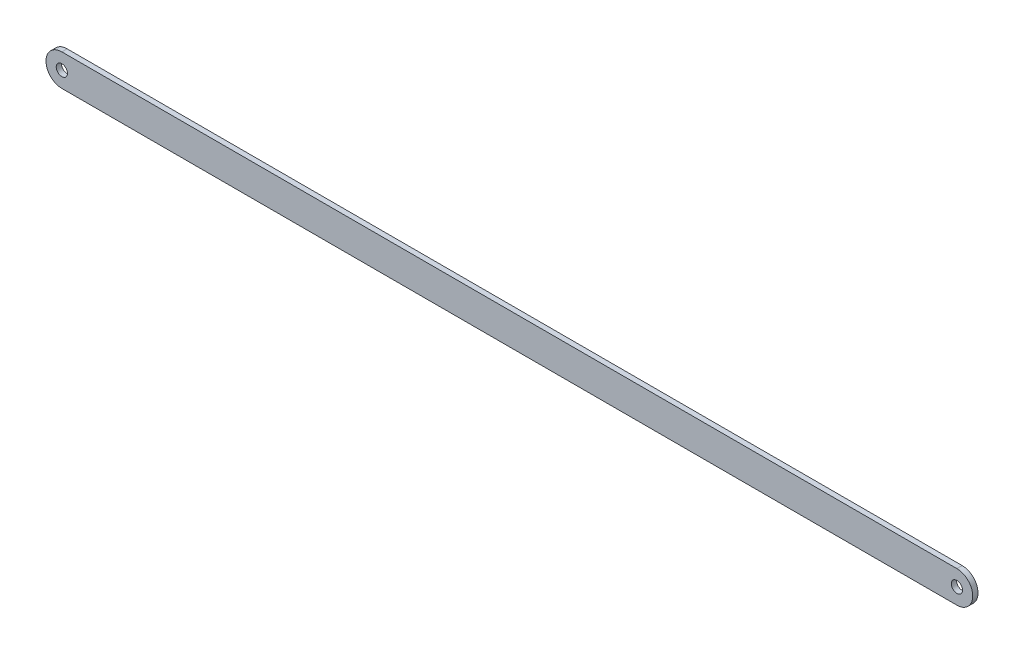
ISO-10303-21;
HEADER;
FILE_DESCRIPTION(('STEP AP214'),'2;1');
FILE_NAME('part.step','',(''),(''),'','','');
FILE_SCHEMA(('AUTOMOTIVE_DESIGN { 1 0 10303 214 1 1 1 1 }'));
ENDSEC;
DATA;
#1=APPLICATION_CONTEXT('core data for automotive mechanical design processes');
#2=APPLICATION_PROTOCOL_DEFINITION('international standard','automotive_design',2000,#1);
#3=PRODUCT_CONTEXT('',#1,'mechanical');
#4=PRODUCT('Part','Part','',(#3));
#5=PRODUCT_RELATED_PRODUCT_CATEGORY('part','',(#4));
#6=PRODUCT_DEFINITION_FORMATION('','',#4);
#7=PRODUCT_DEFINITION_CONTEXT('part definition',#1,'design');
#8=PRODUCT_DEFINITION('design','',#6,#7);
#9=PRODUCT_DEFINITION_SHAPE('','',#8);
#10=(LENGTH_UNIT() NAMED_UNIT(*) SI_UNIT(.MILLI.,.METRE.));
#11=(NAMED_UNIT(*) PLANE_ANGLE_UNIT() SI_UNIT($,.RADIAN.));
#12=(NAMED_UNIT(*) SI_UNIT($,.STERADIAN.) SOLID_ANGLE_UNIT());
#13=UNCERTAINTY_MEASURE_WITH_UNIT(LENGTH_MEASURE(1.E-05),#10,'distance_accuracy_value','');
#14=(GEOMETRIC_REPRESENTATION_CONTEXT(3) GLOBAL_UNCERTAINTY_ASSIGNED_CONTEXT((#13)) GLOBAL_UNIT_ASSIGNED_CONTEXT((#10,
#11,#12)) REPRESENTATION_CONTEXT('',''));
#15=CARTESIAN_POINT('',(0.,0.,0.));
#16=DIRECTION('',(0.,0.,1.));
#17=DIRECTION('',(1.,0.,0.));
#18=AXIS2_PLACEMENT_3D('',#15,#16,#17);
#19=CARTESIAN_POINT('',(269.108175275297,-1.31838984174237E-13,1.5875));
#20=DIRECTION('',(0.,0.,-1.));
#21=DIRECTION('',(-1.,0.,0.));
#22=AXIS2_PLACEMENT_3D('',#19,#20,#21);
#23=CYLINDRICAL_SURFACE('',#22,9.52499999999997);
#24=CARTESIAN_POINT('',(269.108175275297,-1.31838984174237E-13,-1.5875));
#25=DIRECTION('',(0.,0.,1.));
#26=DIRECTION('',(1.,0.,0.));
#27=AXIS2_PLACEMENT_3D('',#24,#25,#26);
#28=CIRCLE('',#27,9.52499999999997);
#29=CARTESIAN_POINT('',(269.108175275297,-9.52499999999997,-1.5875));
#30=VERTEX_POINT('',#29);
#31=CARTESIAN_POINT('',(269.108175275297,9.52499999999996,-1.5875));
#32=VERTEX_POINT('',#31);
#33=EDGE_CURVE('E97',#30,#32,#28,.T.);
#34=ORIENTED_EDGE('',*,*,#33,.T.);
#35=DIRECTION('',(0.,0.,-1.));
#36=VECTOR('',#35,1.);
#37=CARTESIAN_POINT('',(269.108175275297,9.52499999999996,1.5875));
#38=LINE('',#37,#36);
#39=CARTESIAN_POINT('',(269.108175275297,9.52499999999996,1.5875));
#40=VERTEX_POINT('',#39);
#41=EDGE_CURVE('E11',#40,#32,#38,.T.);
#42=ORIENTED_EDGE('',*,*,#41,.F.);
#43=CARTESIAN_POINT('',(269.108175275297,-1.31838984174237E-13,1.5875));
#44=DIRECTION('',(0.,0.,1.));
#45=DIRECTION('',(1.,0.,0.));
#46=AXIS2_PLACEMENT_3D('',#43,#44,#45);
#47=CIRCLE('',#46,9.52499999999997);
#48=CARTESIAN_POINT('',(269.108175275297,-9.52499999999997,1.5875));
#49=VERTEX_POINT('',#48);
#50=EDGE_CURVE('E85',#49,#40,#47,.T.);
#51=ORIENTED_EDGE('',*,*,#50,.F.);
#52=DIRECTION('',(0.,0.,-1.));
#53=VECTOR('',#52,1.);
#54=CARTESIAN_POINT('',(269.108175275297,-9.52499999999997,1.5875));
#55=LINE('',#54,#53);
#56=EDGE_CURVE('E93',#49,#30,#55,.T.);
#57=ORIENTED_EDGE('',*,*,#56,.T.);
#58=EDGE_LOOP('',(#34,#42,#51,#57));
#59=FACE_BOUND('',#58,.T.);
#60=ADVANCED_FACE('F34',(#59),#23,.T.);
#61=CARTESIAN_POINT('',(269.108175275297,9.52499999999996,1.5875));
#62=DIRECTION('',(0.,-1.,0.));
#63=DIRECTION('',(1.,0.,0.));
#64=AXIS2_PLACEMENT_3D('',#61,#62,#63);
#65=PLANE('',#64);
#66=DIRECTION('',(-1.,0.,0.));
#67=VECTOR('',#66,1.);
#68=CARTESIAN_POINT('',(269.108175275297,9.52499999999996,-1.5875));
#69=LINE('',#68,#67);
#70=CARTESIAN_POINT('',(-269.108175275297,9.52499999999992,-1.5875));
#71=VERTEX_POINT('',#70);
#72=EDGE_CURVE('E89',#32,#71,#69,.T.);
#73=ORIENTED_EDGE('',*,*,#72,.T.);
#74=DIRECTION('',(0.,0.,-1.));
#75=VECTOR('',#74,1.);
#76=CARTESIAN_POINT('',(-269.108175275297,9.52499999999992,1.5875));
#77=LINE('',#76,#75);
#78=CARTESIAN_POINT('',(-269.108175275297,9.52499999999992,1.5875));
#79=VERTEX_POINT('',#78);
#80=EDGE_CURVE('E42',#79,#71,#77,.T.);
#81=ORIENTED_EDGE('',*,*,#80,.F.);
#82=DIRECTION('',(-1.,0.,0.));
#83=VECTOR('',#82,1.);
#84=CARTESIAN_POINT('',(269.108175275297,9.52499999999996,1.5875));
#85=LINE('',#84,#83);
#86=EDGE_CURVE('E80',#40,#79,#85,.T.);
#87=ORIENTED_EDGE('',*,*,#86,.F.);
#88=ORIENTED_EDGE('',*,*,#41,.T.);
#89=EDGE_LOOP('',(#73,#81,#87,#88));
#90=FACE_BOUND('',#89,.T.);
#91=ADVANCED_FACE('F88',(#90),#65,.F.);
#92=CARTESIAN_POINT('',(-269.108175275297,0.,1.5875));
#93=DIRECTION('',(0.,0.,-1.));
#94=DIRECTION('',(-1.,0.,0.));
#95=AXIS2_PLACEMENT_3D('',#92,#93,#94);
#96=CYLINDRICAL_SURFACE('',#95,9.52499999999997);
#97=CARTESIAN_POINT('',(-269.108175275297,0.,-1.5875));
#98=DIRECTION('',(0.,0.,1.));
#99=DIRECTION('',(1.,0.,0.));
#100=AXIS2_PLACEMENT_3D('',#97,#98,#99);
#101=CIRCLE('',#100,9.52499999999997);
#102=CARTESIAN_POINT('',(-269.108175275297,-9.52500000000003,-1.5875));
#103=VERTEX_POINT('',#102);
#104=EDGE_CURVE('E67',#71,#103,#101,.T.);
#105=ORIENTED_EDGE('',*,*,#104,.T.);
#106=DIRECTION('',(0.,0.,-1.));
#107=VECTOR('',#106,1.);
#108=CARTESIAN_POINT('',(-269.108175275297,-9.52500000000003,1.5875));
#109=LINE('',#108,#107);
#110=CARTESIAN_POINT('',(-269.108175275297,-9.52500000000003,1.5875));
#111=VERTEX_POINT('',#110);
#112=EDGE_CURVE('E90',#111,#103,#109,.T.);
#113=ORIENTED_EDGE('',*,*,#112,.F.);
#114=CARTESIAN_POINT('',(-269.108175275297,0.,1.5875));
#115=DIRECTION('',(0.,0.,1.));
#116=DIRECTION('',(1.,0.,0.));
#117=AXIS2_PLACEMENT_3D('',#114,#115,#116);
#118=CIRCLE('',#117,9.52499999999997);
#119=EDGE_CURVE('E83',#79,#111,#118,.T.);
#120=ORIENTED_EDGE('',*,*,#119,.F.);
#121=ORIENTED_EDGE('',*,*,#80,.T.);
#122=EDGE_LOOP('',(#105,#113,#120,#121));
#123=FACE_BOUND('',#122,.T.);
#124=ADVANCED_FACE('F91',(#123),#96,.T.);
#125=CARTESIAN_POINT('',(269.108175275297,-9.52499999999997,1.5875));
#126=DIRECTION('',(0.,1.,0.));
#127=DIRECTION('',(-1.,0.,0.));
#128=AXIS2_PLACEMENT_3D('',#125,#126,#127);
#129=PLANE('',#128);
#130=DIRECTION('',(1.,0.,0.));
#131=VECTOR('',#130,1.);
#132=CARTESIAN_POINT('',(269.108175275297,-9.52499999999997,-1.5875));
#133=LINE('',#132,#131);
#134=EDGE_CURVE('E73',#103,#30,#133,.T.);
#135=ORIENTED_EDGE('',*,*,#134,.T.);
#136=ORIENTED_EDGE('',*,*,#56,.F.);
#137=DIRECTION('',(1.,0.,0.));
#138=VECTOR('',#137,1.);
#139=CARTESIAN_POINT('',(269.108175275297,-9.52499999999997,1.5875));
#140=LINE('',#139,#138);
#141=EDGE_CURVE('E50',#111,#49,#140,.T.);
#142=ORIENTED_EDGE('',*,*,#141,.F.);
#143=ORIENTED_EDGE('',*,*,#112,.T.);
#144=EDGE_LOOP('',(#135,#136,#142,#143));
#145=FACE_BOUND('',#144,.T.);
#146=ADVANCED_FACE('F105',(#145),#129,.F.);
#147=CARTESIAN_POINT('',(269.108175275297,-1.31838984174237E-13,1.5875));
#148=DIRECTION('',(0.,0.,1.));
#149=DIRECTION('',(1.,0.,0.));
#150=AXIS2_PLACEMENT_3D('',#147,#148,#149);
#151=PLANE('',#150);
#152=CARTESIAN_POINT('',(-269.108175275297,0.,1.5875));
#153=DIRECTION('',(0.,0.,1.));
#154=DIRECTION('',(1.,0.,0.));
#155=AXIS2_PLACEMENT_3D('',#152,#153,#154);
#156=CIRCLE('',#155,3.3782);
#157=CARTESIAN_POINT('',(-265.729975275297,0.,1.5875));
#158=VERTEX_POINT('',#157);
#159=EDGE_CURVE('E119',#158,#158,#156,.T.);
#160=ORIENTED_EDGE('',*,*,#159,.F.);
#161=EDGE_LOOP('',(#160));
#162=FACE_BOUND('',#161,.T.);
#163=CARTESIAN_POINT('',(269.108175275297,-1.31838984174237E-13,1.5875));
#164=DIRECTION('',(0.,0.,1.));
#165=DIRECTION('',(1.,0.,0.));
#166=AXIS2_PLACEMENT_3D('',#163,#164,#165);
#167=CIRCLE('',#166,3.3782);
#168=CARTESIAN_POINT('',(272.486375275297,-1.31838984174237E-13,1.5875));
#169=VERTEX_POINT('',#168);
#170=EDGE_CURVE('E113',#169,#169,#167,.T.);
#171=ORIENTED_EDGE('',*,*,#170,.F.);
#172=EDGE_LOOP('',(#171));
#173=FACE_BOUND('',#172,.T.);
#174=ORIENTED_EDGE('',*,*,#50,.T.);
#175=ORIENTED_EDGE('',*,*,#86,.T.);
#176=ORIENTED_EDGE('',*,*,#119,.T.);
#177=ORIENTED_EDGE('',*,*,#141,.T.);
#178=EDGE_LOOP('',(#174,#175,#176,#177));
#179=FACE_BOUND('',#178,.T.);
#180=ADVANCED_FACE('F81',(#162,#173,#179),#151,.T.);
#181=CARTESIAN_POINT('',(269.108175275297,-1.31838984174237E-13,-1.5875));
#182=DIRECTION('',(0.,0.,1.));
#183=DIRECTION('',(1.,0.,0.));
#184=AXIS2_PLACEMENT_3D('',#181,#182,#183);
#185=PLANE('',#184);
#186=CARTESIAN_POINT('',(-269.108175275297,0.,-1.5875));
#187=DIRECTION('',(0.,0.,1.));
#188=DIRECTION('',(1.,0.,0.));
#189=AXIS2_PLACEMENT_3D('',#186,#187,#188);
#190=CIRCLE('',#189,3.3782);
#191=CARTESIAN_POINT('',(-265.729975275297,0.,-1.5875));
#192=VERTEX_POINT('',#191);
#193=EDGE_CURVE('E116',#192,#192,#190,.T.);
#194=ORIENTED_EDGE('',*,*,#193,.T.);
#195=EDGE_LOOP('',(#194));
#196=FACE_BOUND('',#195,.T.);
#197=CARTESIAN_POINT('',(269.108175275297,-1.31838984174237E-13,-1.5875));
#198=DIRECTION('',(0.,0.,1.));
#199=DIRECTION('',(1.,0.,0.));
#200=AXIS2_PLACEMENT_3D('',#197,#198,#199);
#201=CIRCLE('',#200,3.3782);
#202=CARTESIAN_POINT('',(272.486375275297,-1.31838984174237E-13,-1.5875));
#203=VERTEX_POINT('',#202);
#204=EDGE_CURVE('E100',#203,#203,#201,.T.);
#205=ORIENTED_EDGE('',*,*,#204,.T.);
#206=EDGE_LOOP('',(#205));
#207=FACE_BOUND('',#206,.T.);
#208=ORIENTED_EDGE('',*,*,#33,.F.);
#209=ORIENTED_EDGE('',*,*,#134,.F.);
#210=ORIENTED_EDGE('',*,*,#104,.F.);
#211=ORIENTED_EDGE('',*,*,#72,.F.);
#212=EDGE_LOOP('',(#208,#209,#210,#211));
#213=FACE_BOUND('',#212,.T.);
#214=ADVANCED_FACE('F108',(#196,#207,#213),#185,.F.);
#215=CARTESIAN_POINT('',(269.108175275297,-1.31838984174237E-13,1.5875));
#216=DIRECTION('',(0.,0.,1.));
#217=DIRECTION('',(1.,0.,0.));
#218=AXIS2_PLACEMENT_3D('',#215,#216,#217);
#219=CYLINDRICAL_SURFACE('',#218,3.3782);
#220=ORIENTED_EDGE('',*,*,#204,.F.);
#221=EDGE_LOOP('',(#220));
#222=FACE_BOUND('',#221,.T.);
#223=ORIENTED_EDGE('',*,*,#170,.T.);
#224=EDGE_LOOP('',(#223));
#225=FACE_BOUND('',#224,.T.);
#226=ADVANCED_FACE('F130',(#222,#225),#219,.F.);
#227=CARTESIAN_POINT('',(-269.108175275297,0.,1.5875));
#228=DIRECTION('',(0.,0.,1.));
#229=DIRECTION('',(1.,0.,0.));
#230=AXIS2_PLACEMENT_3D('',#227,#228,#229);
#231=CYLINDRICAL_SURFACE('',#230,3.3782);
#232=ORIENTED_EDGE('',*,*,#193,.F.);
#233=EDGE_LOOP('',(#232));
#234=FACE_BOUND('',#233,.T.);
#235=ORIENTED_EDGE('',*,*,#159,.T.);
#236=EDGE_LOOP('',(#235));
#237=FACE_BOUND('',#236,.T.);
#238=ADVANCED_FACE('F123',(#234,#237),#231,.F.);
#239=CLOSED_SHELL('',(#60,#91,#124,#146,#180,#214,#226,#238));
#240=MANIFOLD_SOLID_BREP('B2',#239);
#241=ADVANCED_BREP_SHAPE_REPRESENTATION('',(#18,#240),#14);
#242=SHAPE_DEFINITION_REPRESENTATION(#9,#241);
ENDSEC;
END-ISO-10303-21;
